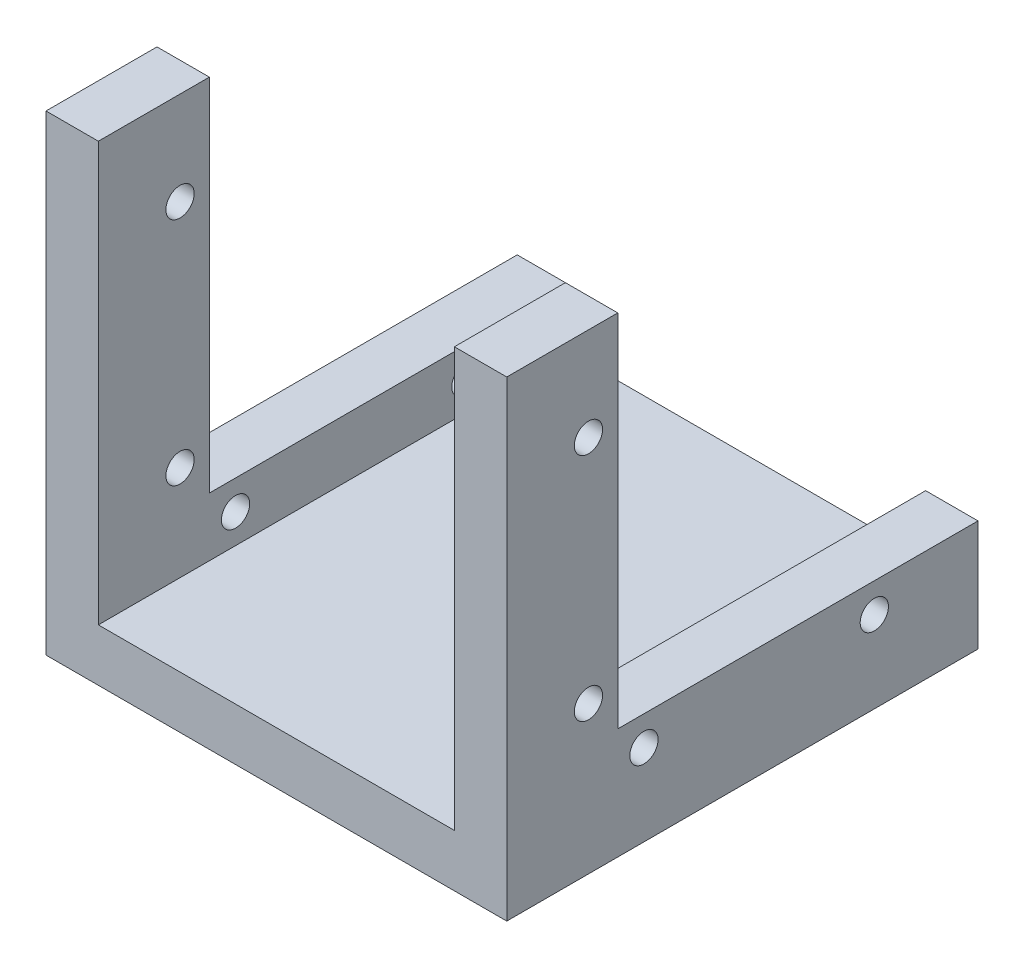
ISO-10303-21;
HEADER;
FILE_DESCRIPTION(('STEP AP214'),'2;1');
FILE_NAME('part.step','',(''),(''),'','','');
FILE_SCHEMA(('AUTOMOTIVE_DESIGN { 1 0 10303 214 1 1 1 1 }'));
ENDSEC;
DATA;
#1=APPLICATION_CONTEXT('core data for automotive mechanical design processes');
#2=APPLICATION_PROTOCOL_DEFINITION('international standard','automotive_design',2000,#1);
#3=PRODUCT_CONTEXT('',#1,'mechanical');
#4=PRODUCT('Part','Part','',(#3));
#5=PRODUCT_RELATED_PRODUCT_CATEGORY('part','',(#4));
#6=PRODUCT_DEFINITION_FORMATION('','',#4);
#7=PRODUCT_DEFINITION_CONTEXT('part definition',#1,'design');
#8=PRODUCT_DEFINITION('design','',#6,#7);
#9=PRODUCT_DEFINITION_SHAPE('','',#8);
#10=(LENGTH_UNIT() NAMED_UNIT(*) SI_UNIT(.MILLI.,.METRE.));
#11=(NAMED_UNIT(*) PLANE_ANGLE_UNIT() SI_UNIT($,.RADIAN.));
#12=(NAMED_UNIT(*) SI_UNIT($,.STERADIAN.) SOLID_ANGLE_UNIT());
#13=UNCERTAINTY_MEASURE_WITH_UNIT(LENGTH_MEASURE(1.E-05),#10,'distance_accuracy_value','');
#14=(GEOMETRIC_REPRESENTATION_CONTEXT(3) GLOBAL_UNCERTAINTY_ASSIGNED_CONTEXT((#13)) GLOBAL_UNIT_ASSIGNED_CONTEXT((#10,
#11,#12)) REPRESENTATION_CONTEXT('',''));
#15=CARTESIAN_POINT('',(0.,0.,0.));
#16=DIRECTION('',(0.,0.,1.));
#17=DIRECTION('',(1.,0.,0.));
#18=AXIS2_PLACEMENT_3D('',#15,#16,#17);
#19=CARTESIAN_POINT('',(0.,45.,45.));
#20=DIRECTION('',(1.,0.,0.));
#21=DIRECTION('',(0.,1.,0.));
#22=AXIS2_PLACEMENT_3D('',#19,#20,#21);
#23=PLANE('',#22);
#24=CARTESIAN_POINT('',(0.,7.80000000000001,9.90000000000001));
#25=DIRECTION('',(1.,0.,0.));
#26=DIRECTION('',(0.,0.,-1.));
#27=AXIS2_PLACEMENT_3D('',#24,#25,#26);
#28=CIRCLE('',#27,1.35);
#29=CARTESIAN_POINT('',(0.,7.80000000000001,8.55000000000001));
#30=VERTEX_POINT('',#29);
#31=EDGE_CURVE('E265',#30,#30,#28,.T.);
#32=ORIENTED_EDGE('',*,*,#31,.T.);
#33=EDGE_LOOP('',(#32));
#34=FACE_BOUND('',#33,.T.);
#35=CARTESIAN_POINT('',(0.,7.80000000000001,31.9));
#36=DIRECTION('',(1.,0.,0.));
#37=DIRECTION('',(0.,0.,-1.));
#38=AXIS2_PLACEMENT_3D('',#35,#36,#37);
#39=CIRCLE('',#38,1.35000000000001);
#40=CARTESIAN_POINT('',(0.,7.80000000000001,30.55));
#41=VERTEX_POINT('',#40);
#42=EDGE_CURVE('E272',#41,#41,#39,.T.);
#43=ORIENTED_EDGE('',*,*,#42,.T.);
#44=EDGE_LOOP('',(#43));
#45=FACE_BOUND('',#44,.T.);
#46=CARTESIAN_POINT('',(0.,14.1,37.2));
#47=DIRECTION('',(1.,0.,0.));
#48=DIRECTION('',(0.,0.,-1.));
#49=AXIS2_PLACEMENT_3D('',#46,#47,#48);
#50=CIRCLE('',#49,1.35);
#51=CARTESIAN_POINT('',(0.,14.1,35.85));
#52=VERTEX_POINT('',#51);
#53=EDGE_CURVE('E278',#52,#52,#50,.T.);
#54=ORIENTED_EDGE('',*,*,#53,.T.);
#55=EDGE_LOOP('',(#54));
#56=FACE_BOUND('',#55,.T.);
#57=CARTESIAN_POINT('',(0.,36.1,37.2));
#58=DIRECTION('',(1.,0.,0.));
#59=DIRECTION('',(0.,0.,-1.));
#60=AXIS2_PLACEMENT_3D('',#57,#58,#59);
#61=CIRCLE('',#60,1.35);
#62=CARTESIAN_POINT('',(0.,36.1,35.85));
#63=VERTEX_POINT('',#62);
#64=EDGE_CURVE('E264',#63,#63,#61,.T.);
#65=ORIENTED_EDGE('',*,*,#64,.T.);
#66=EDGE_LOOP('',(#65));
#67=FACE_BOUND('',#66,.T.);
#68=DIRECTION('',(0.,-1.,0.));
#69=VECTOR('',#68,1.);
#70=CARTESIAN_POINT('',(0.,10.6,34.4));
#71=LINE('',#70,#69);
#72=CARTESIAN_POINT('',(0.,45.,34.4));
#73=VERTEX_POINT('',#72);
#74=CARTESIAN_POINT('',(0.,10.6,34.4));
#75=VERTEX_POINT('',#74);
#76=EDGE_CURVE('E255',#73,#75,#71,.T.);
#77=ORIENTED_EDGE('',*,*,#76,.T.);
#78=DIRECTION('',(0.,0.,-1.));
#79=VECTOR('',#78,1.);
#80=CARTESIAN_POINT('',(0.,10.6,34.4));
#81=LINE('',#80,#79);
#82=CARTESIAN_POINT('',(0.,10.6,0.));
#83=VERTEX_POINT('',#82);
#84=EDGE_CURVE('E147',#75,#83,#81,.T.);
#85=ORIENTED_EDGE('',*,*,#84,.T.);
#86=DIRECTION('',(0.,-1.,0.));
#87=VECTOR('',#86,1.);
#88=CARTESIAN_POINT('',(0.,45.,0.));
#89=LINE('',#88,#87);
#90=CARTESIAN_POINT('',(0.,0.,0.));
#91=VERTEX_POINT('',#90);
#92=EDGE_CURVE('E186',#83,#91,#89,.T.);
#93=ORIENTED_EDGE('',*,*,#92,.T.);
#94=DIRECTION('',(0.,0.,-1.));
#95=VECTOR('',#94,1.);
#96=CARTESIAN_POINT('',(0.,0.,45.));
#97=LINE('',#96,#95);
#98=CARTESIAN_POINT('',(0.,0.,45.));
#99=VERTEX_POINT('',#98);
#100=EDGE_CURVE('E44',#99,#91,#97,.T.);
#101=ORIENTED_EDGE('',*,*,#100,.F.);
#102=DIRECTION('',(0.,-1.,0.));
#103=VECTOR('',#102,1.);
#104=CARTESIAN_POINT('',(0.,45.,45.));
#105=LINE('',#104,#103);
#106=CARTESIAN_POINT('',(0.,45.,45.));
#107=VERTEX_POINT('',#106);
#108=EDGE_CURVE('E187',#107,#99,#105,.T.);
#109=ORIENTED_EDGE('',*,*,#108,.F.);
#110=DIRECTION('',(0.,0.,-1.));
#111=VECTOR('',#110,1.);
#112=CARTESIAN_POINT('',(0.,45.,45.));
#113=LINE('',#112,#111);
#114=EDGE_CURVE('E204',#107,#73,#113,.T.);
#115=ORIENTED_EDGE('',*,*,#114,.T.);
#116=EDGE_LOOP('',(#77,#85,#93,#101,#109,#115));
#117=FACE_BOUND('',#116,.T.);
#118=ADVANCED_FACE('F36',(#34,#45,#56,#67,#117),#23,.F.);
#119=CARTESIAN_POINT('',(0.,0.,45.));
#120=DIRECTION('',(0.,1.,0.));
#121=DIRECTION('',(0.,0.,1.));
#122=AXIS2_PLACEMENT_3D('',#119,#120,#121);
#123=PLANE('',#122);
#124=DIRECTION('',(1.,0.,0.));
#125=VECTOR('',#124,1.);
#126=CARTESIAN_POINT('',(0.,0.,0.));
#127=LINE('',#126,#125);
#128=CARTESIAN_POINT('',(44.,0.,0.));
#129=VERTEX_POINT('',#128);
#130=EDGE_CURVE('E206',#91,#129,#127,.T.);
#131=ORIENTED_EDGE('',*,*,#130,.T.);
#132=DIRECTION('',(0.,0.,-1.));
#133=VECTOR('',#132,1.);
#134=CARTESIAN_POINT('',(44.,0.,45.));
#135=LINE('',#134,#133);
#136=CARTESIAN_POINT('',(44.,0.,45.));
#137=VERTEX_POINT('',#136);
#138=EDGE_CURVE('E151',#137,#129,#135,.T.);
#139=ORIENTED_EDGE('',*,*,#138,.F.);
#140=DIRECTION('',(1.,0.,0.));
#141=VECTOR('',#140,1.);
#142=CARTESIAN_POINT('',(0.,0.,45.));
#143=LINE('',#142,#141);
#144=EDGE_CURVE('E190',#99,#137,#143,.T.);
#145=ORIENTED_EDGE('',*,*,#144,.F.);
#146=ORIENTED_EDGE('',*,*,#100,.T.);
#147=EDGE_LOOP('',(#131,#139,#145,#146));
#148=FACE_BOUND('',#147,.T.);
#149=ADVANCED_FACE('F293',(#148),#123,.F.);
#150=CARTESIAN_POINT('',(44.,0.,45.));
#151=DIRECTION('',(-1.,0.,0.));
#152=DIRECTION('',(0.,0.,1.));
#153=AXIS2_PLACEMENT_3D('',#150,#151,#152);
#154=PLANE('',#153);
#155=CARTESIAN_POINT('',(44.,7.80000000000001,9.90000000000001));
#156=DIRECTION('',(1.,0.,0.));
#157=DIRECTION('',(0.,0.,-1.));
#158=AXIS2_PLACEMENT_3D('',#155,#156,#157);
#159=CIRCLE('',#158,1.35);
#160=CARTESIAN_POINT('',(44.,7.80000000000001,8.55000000000001));
#161=VERTEX_POINT('',#160);
#162=EDGE_CURVE('E269',#161,#161,#159,.T.);
#163=ORIENTED_EDGE('',*,*,#162,.F.);
#164=EDGE_LOOP('',(#163));
#165=FACE_BOUND('',#164,.T.);
#166=CARTESIAN_POINT('',(44.,7.80000000000001,31.9));
#167=DIRECTION('',(1.,0.,0.));
#168=DIRECTION('',(0.,0.,-1.));
#169=AXIS2_PLACEMENT_3D('',#166,#167,#168);
#170=CIRCLE('',#169,1.35000000000001);
#171=CARTESIAN_POINT('',(44.,7.80000000000001,30.55));
#172=VERTEX_POINT('',#171);
#173=EDGE_CURVE('E268',#172,#172,#170,.T.);
#174=ORIENTED_EDGE('',*,*,#173,.F.);
#175=EDGE_LOOP('',(#174));
#176=FACE_BOUND('',#175,.T.);
#177=CARTESIAN_POINT('',(44.,14.1,37.2));
#178=DIRECTION('',(1.,0.,0.));
#179=DIRECTION('',(0.,0.,-1.));
#180=AXIS2_PLACEMENT_3D('',#177,#178,#179);
#181=CIRCLE('',#180,1.35);
#182=CARTESIAN_POINT('',(44.,14.1,35.85));
#183=VERTEX_POINT('',#182);
#184=EDGE_CURVE('E275',#183,#183,#181,.T.);
#185=ORIENTED_EDGE('',*,*,#184,.F.);
#186=EDGE_LOOP('',(#185));
#187=FACE_BOUND('',#186,.T.);
#188=CARTESIAN_POINT('',(44.,36.1,37.2));
#189=DIRECTION('',(1.,0.,0.));
#190=DIRECTION('',(0.,0.,-1.));
#191=AXIS2_PLACEMENT_3D('',#188,#189,#190);
#192=CIRCLE('',#191,1.35);
#193=CARTESIAN_POINT('',(44.,36.1,35.85));
#194=VERTEX_POINT('',#193);
#195=EDGE_CURVE('E281',#194,#194,#192,.T.);
#196=ORIENTED_EDGE('',*,*,#195,.F.);
#197=EDGE_LOOP('',(#196));
#198=FACE_BOUND('',#197,.T.);
#199=DIRECTION('',(0.,1.,0.));
#200=VECTOR('',#199,1.);
#201=CARTESIAN_POINT('',(44.,0.,0.));
#202=LINE('',#201,#200);
#203=CARTESIAN_POINT('',(44.,10.6,0.));
#204=VERTEX_POINT('',#203);
#205=EDGE_CURVE('E208',#129,#204,#202,.T.);
#206=ORIENTED_EDGE('',*,*,#205,.T.);
#207=DIRECTION('',(0.,0.,-1.));
#208=VECTOR('',#207,1.);
#209=CARTESIAN_POINT('',(44.,10.6,34.4));
#210=LINE('',#209,#208);
#211=CARTESIAN_POINT('',(44.,10.6,34.4));
#212=VERTEX_POINT('',#211);
#213=EDGE_CURVE('E52',#212,#204,#210,.T.);
#214=ORIENTED_EDGE('',*,*,#213,.F.);
#215=DIRECTION('',(0.,-1.,0.));
#216=VECTOR('',#215,1.);
#217=CARTESIAN_POINT('',(44.,10.6,34.4));
#218=LINE('',#217,#216);
#219=CARTESIAN_POINT('',(44.,45.,34.4));
#220=VERTEX_POINT('',#219);
#221=EDGE_CURVE('E130',#220,#212,#218,.T.);
#222=ORIENTED_EDGE('',*,*,#221,.F.);
#223=DIRECTION('',(0.,0.,-1.));
#224=VECTOR('',#223,1.);
#225=CARTESIAN_POINT('',(44.,45.,45.));
#226=LINE('',#225,#224);
#227=CARTESIAN_POINT('',(44.,45.,45.));
#228=VERTEX_POINT('',#227);
#229=EDGE_CURVE('E145',#228,#220,#226,.T.);
#230=ORIENTED_EDGE('',*,*,#229,.F.);
#231=DIRECTION('',(0.,1.,0.));
#232=VECTOR('',#231,1.);
#233=CARTESIAN_POINT('',(44.,0.,45.));
#234=LINE('',#233,#232);
#235=EDGE_CURVE('E193',#137,#228,#234,.T.);
#236=ORIENTED_EDGE('',*,*,#235,.F.);
#237=ORIENTED_EDGE('',*,*,#138,.T.);
#238=EDGE_LOOP('',(#206,#214,#222,#230,#236,#237));
#239=FACE_BOUND('',#238,.T.);
#240=ADVANCED_FACE('F143',(#165,#176,#187,#198,#239),#154,.F.);
#241=CARTESIAN_POINT('',(44.,45.,45.));
#242=DIRECTION('',(0.,-1.,0.));
#243=DIRECTION('',(0.,0.,-1.));
#244=AXIS2_PLACEMENT_3D('',#241,#242,#243);
#245=PLANE('',#244);
#246=ORIENTED_EDGE('',*,*,#229,.T.);
#247=DIRECTION('',(1.,0.,0.));
#248=VECTOR('',#247,1.);
#249=CARTESIAN_POINT('',(0.,45.,34.4));
#250=LINE('',#249,#248);
#251=CARTESIAN_POINT('',(39.,45.,34.4));
#252=VERTEX_POINT('',#251);
#253=EDGE_CURVE('E126',#252,#220,#250,.T.);
#254=ORIENTED_EDGE('',*,*,#253,.F.);
#255=DIRECTION('',(0.,0.,-1.));
#256=VECTOR('',#255,1.);
#257=CARTESIAN_POINT('',(39.,45.,45.));
#258=LINE('',#257,#256);
#259=CARTESIAN_POINT('',(39.,45.,45.));
#260=VERTEX_POINT('',#259);
#261=EDGE_CURVE('E152',#260,#252,#258,.T.);
#262=ORIENTED_EDGE('',*,*,#261,.F.);
#263=DIRECTION('',(-1.,0.,0.));
#264=VECTOR('',#263,1.);
#265=CARTESIAN_POINT('',(44.,45.,45.));
#266=LINE('',#265,#264);
#267=EDGE_CURVE('E150',#228,#260,#266,.T.);
#268=ORIENTED_EDGE('',*,*,#267,.F.);
#269=EDGE_LOOP('',(#246,#254,#262,#268));
#270=FACE_BOUND('',#269,.T.);
#271=ADVANCED_FACE('F149',(#270),#245,.F.);
#272=CARTESIAN_POINT('',(39.,45.,45.));
#273=DIRECTION('',(1.,0.,0.));
#274=DIRECTION('',(0.,1.,0.));
#275=AXIS2_PLACEMENT_3D('',#272,#273,#274);
#276=PLANE('',#275);
#277=CARTESIAN_POINT('',(39.,7.80000000000001,9.90000000000001));
#278=DIRECTION('',(1.,0.,0.));
#279=DIRECTION('',(0.,1.,0.));
#280=AXIS2_PLACEMENT_3D('',#277,#278,#279);
#281=CIRCLE('',#280,1.35);
#282=CARTESIAN_POINT('',(39.,9.15000000000002,9.90000000000001));
#283=VERTEX_POINT('',#282);
#284=EDGE_CURVE('E183',#283,#283,#281,.T.);
#285=ORIENTED_EDGE('',*,*,#284,.T.);
#286=EDGE_LOOP('',(#285));
#287=FACE_BOUND('',#286,.T.);
#288=CARTESIAN_POINT('',(39.,7.80000000000001,31.9));
#289=DIRECTION('',(1.,0.,0.));
#290=DIRECTION('',(0.,1.,0.));
#291=AXIS2_PLACEMENT_3D('',#288,#289,#290);
#292=CIRCLE('',#291,1.35000000000001);
#293=CARTESIAN_POINT('',(39.,9.15000000000002,31.9));
#294=VERTEX_POINT('',#293);
#295=EDGE_CURVE('E171',#294,#294,#292,.T.);
#296=ORIENTED_EDGE('',*,*,#295,.T.);
#297=EDGE_LOOP('',(#296));
#298=FACE_BOUND('',#297,.T.);
#299=CARTESIAN_POINT('',(39.,14.1,37.2));
#300=DIRECTION('',(1.,0.,0.));
#301=DIRECTION('',(0.,1.,0.));
#302=AXIS2_PLACEMENT_3D('',#299,#300,#301);
#303=CIRCLE('',#302,1.35);
#304=CARTESIAN_POINT('',(39.,15.45,37.2));
#305=VERTEX_POINT('',#304);
#306=EDGE_CURVE('E168',#305,#305,#303,.T.);
#307=ORIENTED_EDGE('',*,*,#306,.T.);
#308=EDGE_LOOP('',(#307));
#309=FACE_BOUND('',#308,.T.);
#310=CARTESIAN_POINT('',(39.,36.1,37.2));
#311=DIRECTION('',(1.,0.,0.));
#312=DIRECTION('',(0.,1.,0.));
#313=AXIS2_PLACEMENT_3D('',#310,#311,#312);
#314=CIRCLE('',#313,1.35);
#315=CARTESIAN_POINT('',(39.,37.45,37.2));
#316=VERTEX_POINT('',#315);
#317=EDGE_CURVE('E165',#316,#316,#314,.T.);
#318=ORIENTED_EDGE('',*,*,#317,.T.);
#319=EDGE_LOOP('',(#318));
#320=FACE_BOUND('',#319,.T.);
#321=DIRECTION('',(0.,-1.,0.));
#322=VECTOR('',#321,1.);
#323=CARTESIAN_POINT('',(39.,45.,34.4));
#324=LINE('',#323,#322);
#325=CARTESIAN_POINT('',(39.,10.6,34.4));
#326=VERTEX_POINT('',#325);
#327=EDGE_CURVE('E132',#252,#326,#324,.T.);
#328=ORIENTED_EDGE('',*,*,#327,.T.);
#329=DIRECTION('',(0.,0.,-1.));
#330=VECTOR('',#329,1.);
#331=CARTESIAN_POINT('',(39.,10.6,45.));
#332=LINE('',#331,#330);
#333=CARTESIAN_POINT('',(39.,10.6,0.));
#334=VERTEX_POINT('',#333);
#335=EDGE_CURVE('E248',#326,#334,#332,.T.);
#336=ORIENTED_EDGE('',*,*,#335,.T.);
#337=DIRECTION('',(0.,-1.,0.));
#338=VECTOR('',#337,1.);
#339=CARTESIAN_POINT('',(39.,45.,0.));
#340=LINE('',#339,#338);
#341=CARTESIAN_POINT('',(39.,5.,0.));
#342=VERTEX_POINT('',#341);
#343=EDGE_CURVE('E210',#334,#342,#340,.T.);
#344=ORIENTED_EDGE('',*,*,#343,.T.);
#345=DIRECTION('',(0.,0.,-1.));
#346=VECTOR('',#345,1.);
#347=CARTESIAN_POINT('',(39.,5.,45.));
#348=LINE('',#347,#346);
#349=CARTESIAN_POINT('',(39.,5.,45.));
#350=VERTEX_POINT('',#349);
#351=EDGE_CURVE('E156',#350,#342,#348,.T.);
#352=ORIENTED_EDGE('',*,*,#351,.F.);
#353=DIRECTION('',(0.,-1.,0.));
#354=VECTOR('',#353,1.);
#355=CARTESIAN_POINT('',(39.,45.,45.));
#356=LINE('',#355,#354);
#357=EDGE_CURVE('E196',#260,#350,#356,.T.);
#358=ORIENTED_EDGE('',*,*,#357,.F.);
#359=ORIENTED_EDGE('',*,*,#261,.T.);
#360=EDGE_LOOP('',(#328,#336,#344,#352,#358,#359));
#361=FACE_BOUND('',#360,.T.);
#362=ADVANCED_FACE('F246',(#287,#298,#309,#320,#361),#276,.F.);
#363=CARTESIAN_POINT('',(39.,5.,45.));
#364=DIRECTION('',(0.,-1.,0.));
#365=DIRECTION('',(1.,0.,0.));
#366=AXIS2_PLACEMENT_3D('',#363,#364,#365);
#367=PLANE('',#366);
#368=DIRECTION('',(-1.,0.,0.));
#369=VECTOR('',#368,1.);
#370=CARTESIAN_POINT('',(39.,5.,0.));
#371=LINE('',#370,#369);
#372=CARTESIAN_POINT('',(5.,5.,0.));
#373=VERTEX_POINT('',#372);
#374=EDGE_CURVE('E212',#342,#373,#371,.T.);
#375=ORIENTED_EDGE('',*,*,#374,.T.);
#376=DIRECTION('',(0.,0.,-1.));
#377=VECTOR('',#376,1.);
#378=CARTESIAN_POINT('',(5.,5.,45.));
#379=LINE('',#378,#377);
#380=CARTESIAN_POINT('',(5.,5.,45.));
#381=VERTEX_POINT('',#380);
#382=EDGE_CURVE('E221',#381,#373,#379,.T.);
#383=ORIENTED_EDGE('',*,*,#382,.F.);
#384=DIRECTION('',(-1.,0.,0.));
#385=VECTOR('',#384,1.);
#386=CARTESIAN_POINT('',(39.,5.,45.));
#387=LINE('',#386,#385);
#388=EDGE_CURVE('E198',#350,#381,#387,.T.);
#389=ORIENTED_EDGE('',*,*,#388,.F.);
#390=ORIENTED_EDGE('',*,*,#351,.T.);
#391=EDGE_LOOP('',(#375,#383,#389,#390));
#392=FACE_BOUND('',#391,.T.);
#393=ADVANCED_FACE('F228',(#392),#367,.F.);
#394=CARTESIAN_POINT('',(5.,5.,45.));
#395=DIRECTION('',(-1.,0.,0.));
#396=DIRECTION('',(0.,0.,1.));
#397=AXIS2_PLACEMENT_3D('',#394,#395,#396);
#398=PLANE('',#397);
#399=CARTESIAN_POINT('',(5.,7.80000000000001,9.90000000000001));
#400=DIRECTION('',(-1.,0.,0.));
#401=DIRECTION('',(0.,0.,1.));
#402=AXIS2_PLACEMENT_3D('',#399,#400,#401);
#403=CIRCLE('',#402,1.35);
#404=CARTESIAN_POINT('',(5.,7.80000000000001,11.25));
#405=VERTEX_POINT('',#404);
#406=EDGE_CURVE('E39',#405,#405,#403,.T.);
#407=ORIENTED_EDGE('',*,*,#406,.T.);
#408=EDGE_LOOP('',(#407));
#409=FACE_BOUND('',#408,.T.);
#410=CARTESIAN_POINT('',(5.,7.80000000000001,31.9));
#411=DIRECTION('',(-1.,0.,0.));
#412=DIRECTION('',(0.,0.,1.));
#413=AXIS2_PLACEMENT_3D('',#410,#411,#412);
#414=CIRCLE('',#413,1.35000000000001);
#415=CARTESIAN_POINT('',(5.,7.80000000000001,33.25));
#416=VERTEX_POINT('',#415);
#417=EDGE_CURVE('E169',#416,#416,#414,.T.);
#418=ORIENTED_EDGE('',*,*,#417,.T.);
#419=EDGE_LOOP('',(#418));
#420=FACE_BOUND('',#419,.T.);
#421=CARTESIAN_POINT('',(5.,14.1,37.2));
#422=DIRECTION('',(-1.,0.,0.));
#423=DIRECTION('',(0.,0.,1.));
#424=AXIS2_PLACEMENT_3D('',#421,#422,#423);
#425=CIRCLE('',#424,1.35);
#426=CARTESIAN_POINT('',(5.,14.1,38.55));
#427=VERTEX_POINT('',#426);
#428=EDGE_CURVE('E166',#427,#427,#425,.T.);
#429=ORIENTED_EDGE('',*,*,#428,.T.);
#430=EDGE_LOOP('',(#429));
#431=FACE_BOUND('',#430,.T.);
#432=CARTESIAN_POINT('',(5.,36.1,37.2));
#433=DIRECTION('',(-1.,0.,0.));
#434=DIRECTION('',(0.,0.,1.));
#435=AXIS2_PLACEMENT_3D('',#432,#433,#434);
#436=CIRCLE('',#435,1.35);
#437=CARTESIAN_POINT('',(5.,36.1,38.55));
#438=VERTEX_POINT('',#437);
#439=EDGE_CURVE('E162',#438,#438,#436,.T.);
#440=ORIENTED_EDGE('',*,*,#439,.T.);
#441=EDGE_LOOP('',(#440));
#442=FACE_BOUND('',#441,.T.);
#443=DIRECTION('',(0.,1.,0.));
#444=VECTOR('',#443,1.);
#445=CARTESIAN_POINT('',(5.,5.,0.));
#446=LINE('',#445,#444);
#447=CARTESIAN_POINT('',(5.,10.6,0.));
#448=VERTEX_POINT('',#447);
#449=EDGE_CURVE('E191',#373,#448,#446,.T.);
#450=ORIENTED_EDGE('',*,*,#449,.T.);
#451=DIRECTION('',(0.,0.,1.));
#452=VECTOR('',#451,1.);
#453=CARTESIAN_POINT('',(5.,10.6,45.));
#454=LINE('',#453,#452);
#455=CARTESIAN_POINT('',(5.,10.6,34.4));
#456=VERTEX_POINT('',#455);
#457=EDGE_CURVE('E59',#448,#456,#454,.T.);
#458=ORIENTED_EDGE('',*,*,#457,.T.);
#459=DIRECTION('',(0.,1.,0.));
#460=VECTOR('',#459,1.);
#461=CARTESIAN_POINT('',(5.,5.,34.4));
#462=LINE('',#461,#460);
#463=CARTESIAN_POINT('',(5.,45.,34.4));
#464=VERTEX_POINT('',#463);
#465=EDGE_CURVE('E249',#456,#464,#462,.T.);
#466=ORIENTED_EDGE('',*,*,#465,.T.);
#467=DIRECTION('',(0.,0.,-1.));
#468=VECTOR('',#467,1.);
#469=CARTESIAN_POINT('',(5.,45.,45.));
#470=LINE('',#469,#468);
#471=CARTESIAN_POINT('',(5.,45.,45.));
#472=VERTEX_POINT('',#471);
#473=EDGE_CURVE('E218',#472,#464,#470,.T.);
#474=ORIENTED_EDGE('',*,*,#473,.F.);
#475=DIRECTION('',(0.,1.,0.));
#476=VECTOR('',#475,1.);
#477=CARTESIAN_POINT('',(5.,5.,45.));
#478=LINE('',#477,#476);
#479=EDGE_CURVE('E200',#381,#472,#478,.T.);
#480=ORIENTED_EDGE('',*,*,#479,.F.);
#481=ORIENTED_EDGE('',*,*,#382,.T.);
#482=EDGE_LOOP('',(#450,#458,#466,#474,#480,#481));
#483=FACE_BOUND('',#482,.T.);
#484=ADVANCED_FACE('F238',(#409,#420,#431,#442,#483),#398,.F.);
#485=CARTESIAN_POINT('',(5.,45.,45.));
#486=DIRECTION('',(0.,-1.,0.));
#487=DIRECTION('',(0.,0.,-1.));
#488=AXIS2_PLACEMENT_3D('',#485,#486,#487);
#489=PLANE('',#488);
#490=ORIENTED_EDGE('',*,*,#473,.T.);
#491=EDGE_CURVE('E137',#73,#464,#250,.T.);
#492=ORIENTED_EDGE('',*,*,#491,.F.);
#493=ORIENTED_EDGE('',*,*,#114,.F.);
#494=DIRECTION('',(-1.,0.,0.));
#495=VECTOR('',#494,1.);
#496=CARTESIAN_POINT('',(5.,45.,45.));
#497=LINE('',#496,#495);
#498=EDGE_CURVE('E202',#472,#107,#497,.T.);
#499=ORIENTED_EDGE('',*,*,#498,.F.);
#500=EDGE_LOOP('',(#490,#492,#493,#499));
#501=FACE_BOUND('',#500,.T.);
#502=ADVANCED_FACE('F322',(#501),#489,.F.);
#503=CARTESIAN_POINT('',(0.,0.,45.));
#504=DIRECTION('',(0.,0.,1.));
#505=DIRECTION('',(1.,0.,0.));
#506=AXIS2_PLACEMENT_3D('',#503,#504,#505);
#507=PLANE('',#506);
#508=ORIENTED_EDGE('',*,*,#108,.T.);
#509=ORIENTED_EDGE('',*,*,#144,.T.);
#510=ORIENTED_EDGE('',*,*,#235,.T.);
#511=ORIENTED_EDGE('',*,*,#267,.T.);
#512=ORIENTED_EDGE('',*,*,#357,.T.);
#513=ORIENTED_EDGE('',*,*,#388,.T.);
#514=ORIENTED_EDGE('',*,*,#479,.T.);
#515=ORIENTED_EDGE('',*,*,#498,.T.);
#516=EDGE_LOOP('',(#508,#509,#510,#511,#512,#513,#514,#515));
#517=FACE_BOUND('',#516,.T.);
#518=ADVANCED_FACE('F244',(#517),#507,.T.);
#519=CARTESIAN_POINT('',(0.,0.,0.));
#520=DIRECTION('',(0.,0.,1.));
#521=DIRECTION('',(1.,0.,0.));
#522=AXIS2_PLACEMENT_3D('',#519,#520,#521);
#523=PLANE('',#522);
#524=ORIENTED_EDGE('',*,*,#92,.F.);
#525=DIRECTION('',(1.,0.,0.));
#526=VECTOR('',#525,1.);
#527=CARTESIAN_POINT('',(0.,10.6,0.));
#528=LINE('',#527,#526);
#529=EDGE_CURVE('E138',#83,#448,#528,.T.);
#530=ORIENTED_EDGE('',*,*,#529,.T.);
#531=ORIENTED_EDGE('',*,*,#449,.F.);
#532=ORIENTED_EDGE('',*,*,#374,.F.);
#533=ORIENTED_EDGE('',*,*,#343,.F.);
#534=DIRECTION('',(1.,0.,0.));
#535=VECTOR('',#534,1.);
#536=CARTESIAN_POINT('',(0.,10.6,0.));
#537=LINE('',#536,#535);
#538=EDGE_CURVE('E11',#334,#204,#537,.T.);
#539=ORIENTED_EDGE('',*,*,#538,.T.);
#540=ORIENTED_EDGE('',*,*,#205,.F.);
#541=ORIENTED_EDGE('',*,*,#130,.F.);
#542=EDGE_LOOP('',(#524,#530,#531,#532,#533,#539,#540,#541));
#543=FACE_BOUND('',#542,.T.);
#544=ADVANCED_FACE('F236',(#543),#523,.F.);
#545=CARTESIAN_POINT('',(0.,10.6,34.4));
#546=DIRECTION('',(0.,-1.,0.));
#547=DIRECTION('',(0.,0.,-1.));
#548=AXIS2_PLACEMENT_3D('',#545,#546,#547);
#549=PLANE('',#548);
#550=DIRECTION('',(1.,0.,0.));
#551=VECTOR('',#550,1.);
#552=CARTESIAN_POINT('',(0.,10.6,34.4));
#553=LINE('',#552,#551);
#554=EDGE_CURVE('E257',#326,#212,#553,.T.);
#555=ORIENTED_EDGE('',*,*,#554,.T.);
#556=ORIENTED_EDGE('',*,*,#213,.T.);
#557=ORIENTED_EDGE('',*,*,#538,.F.);
#558=ORIENTED_EDGE('',*,*,#335,.F.);
#559=EDGE_LOOP('',(#555,#556,#557,#558));
#560=FACE_BOUND('',#559,.T.);
#561=ADVANCED_FACE('F327',(#560),#549,.F.);
#562=CARTESIAN_POINT('',(0.,10.6,34.4));
#563=DIRECTION('',(0.,0.,1.));
#564=DIRECTION('',(1.,0.,0.));
#565=AXIS2_PLACEMENT_3D('',#562,#563,#564);
#566=PLANE('',#565);
#567=ORIENTED_EDGE('',*,*,#253,.T.);
#568=ORIENTED_EDGE('',*,*,#221,.T.);
#569=ORIENTED_EDGE('',*,*,#554,.F.);
#570=ORIENTED_EDGE('',*,*,#327,.F.);
#571=EDGE_LOOP('',(#567,#568,#569,#570));
#572=FACE_BOUND('',#571,.T.);
#573=ADVANCED_FACE('F128',(#572),#566,.F.);
#574=EDGE_CURVE('E254',#75,#456,#553,.T.);
#575=ORIENTED_EDGE('',*,*,#574,.F.);
#576=ORIENTED_EDGE('',*,*,#76,.F.);
#577=ORIENTED_EDGE('',*,*,#491,.T.);
#578=ORIENTED_EDGE('',*,*,#465,.F.);
#579=EDGE_LOOP('',(#575,#576,#577,#578));
#580=FACE_BOUND('',#579,.T.);
#581=ADVANCED_FACE('F320',(#580),#566,.F.);
#582=ORIENTED_EDGE('',*,*,#529,.F.);
#583=ORIENTED_EDGE('',*,*,#84,.F.);
#584=ORIENTED_EDGE('',*,*,#574,.T.);
#585=ORIENTED_EDGE('',*,*,#457,.F.);
#586=EDGE_LOOP('',(#582,#583,#584,#585));
#587=FACE_BOUND('',#586,.T.);
#588=ADVANCED_FACE('F330',(#587),#549,.F.);
#589=CARTESIAN_POINT('',(0.,36.1,37.2));
#590=DIRECTION('',(1.,0.,0.));
#591=DIRECTION('',(0.,0.,-1.));
#592=AXIS2_PLACEMENT_3D('',#589,#590,#591);
#593=CYLINDRICAL_SURFACE('',#592,1.35);
#594=ORIENTED_EDGE('',*,*,#64,.F.);
#595=EDGE_LOOP('',(#594));
#596=FACE_BOUND('',#595,.T.);
#597=ORIENTED_EDGE('',*,*,#439,.F.);
#598=EDGE_LOOP('',(#597));
#599=FACE_BOUND('',#598,.T.);
#600=ADVANCED_FACE('F339',(#596,#599),#593,.F.);
#601=CARTESIAN_POINT('',(0.,14.1,37.2));
#602=DIRECTION('',(1.,0.,0.));
#603=DIRECTION('',(0.,0.,-1.));
#604=AXIS2_PLACEMENT_3D('',#601,#602,#603);
#605=CYLINDRICAL_SURFACE('',#604,1.35);
#606=ORIENTED_EDGE('',*,*,#53,.F.);
#607=EDGE_LOOP('',(#606));
#608=FACE_BOUND('',#607,.T.);
#609=ORIENTED_EDGE('',*,*,#428,.F.);
#610=EDGE_LOOP('',(#609));
#611=FACE_BOUND('',#610,.T.);
#612=ADVANCED_FACE('F344',(#608,#611),#605,.F.);
#613=CARTESIAN_POINT('',(0.,7.80000000000001,31.9));
#614=DIRECTION('',(1.,0.,0.));
#615=DIRECTION('',(0.,0.,-1.));
#616=AXIS2_PLACEMENT_3D('',#613,#614,#615);
#617=CYLINDRICAL_SURFACE('',#616,1.35000000000001);
#618=ORIENTED_EDGE('',*,*,#42,.F.);
#619=EDGE_LOOP('',(#618));
#620=FACE_BOUND('',#619,.T.);
#621=ORIENTED_EDGE('',*,*,#417,.F.);
#622=EDGE_LOOP('',(#621));
#623=FACE_BOUND('',#622,.T.);
#624=ADVANCED_FACE('F360',(#620,#623),#617,.F.);
#625=CARTESIAN_POINT('',(0.,7.80000000000001,9.90000000000001));
#626=DIRECTION('',(1.,0.,0.));
#627=DIRECTION('',(0.,0.,-1.));
#628=AXIS2_PLACEMENT_3D('',#625,#626,#627);
#629=CYLINDRICAL_SURFACE('',#628,1.35);
#630=ORIENTED_EDGE('',*,*,#31,.F.);
#631=EDGE_LOOP('',(#630));
#632=FACE_BOUND('',#631,.T.);
#633=ORIENTED_EDGE('',*,*,#406,.F.);
#634=EDGE_LOOP('',(#633));
#635=FACE_BOUND('',#634,.T.);
#636=ADVANCED_FACE('F355',(#632,#635),#629,.F.);
#637=ORIENTED_EDGE('',*,*,#195,.T.);
#638=EDGE_LOOP('',(#637));
#639=FACE_BOUND('',#638,.T.);
#640=ORIENTED_EDGE('',*,*,#317,.F.);
#641=EDGE_LOOP('',(#640));
#642=FACE_BOUND('',#641,.T.);
#643=ADVANCED_FACE('F289',(#639,#642),#593,.F.);
#644=ORIENTED_EDGE('',*,*,#184,.T.);
#645=EDGE_LOOP('',(#644));
#646=FACE_BOUND('',#645,.T.);
#647=ORIENTED_EDGE('',*,*,#306,.F.);
#648=EDGE_LOOP('',(#647));
#649=FACE_BOUND('',#648,.T.);
#650=ADVANCED_FACE('F358',(#646,#649),#605,.F.);
#651=ORIENTED_EDGE('',*,*,#173,.T.);
#652=EDGE_LOOP('',(#651));
#653=FACE_BOUND('',#652,.T.);
#654=ORIENTED_EDGE('',*,*,#295,.F.);
#655=EDGE_LOOP('',(#654));
#656=FACE_BOUND('',#655,.T.);
#657=ADVANCED_FACE('F353',(#653,#656),#617,.F.);
#658=ORIENTED_EDGE('',*,*,#162,.T.);
#659=EDGE_LOOP('',(#658));
#660=FACE_BOUND('',#659,.T.);
#661=ORIENTED_EDGE('',*,*,#284,.F.);
#662=EDGE_LOOP('',(#661));
#663=FACE_BOUND('',#662,.T.);
#664=ADVANCED_FACE('F350',(#660,#663),#629,.F.);
#665=CLOSED_SHELL('',(#118,#149,#240,#271,#362,#393,#484,#502,#518,#544,#561,#573,#581,#588,
#600,#612,#624,#636,#643,#650,#657,#664));
#666=MANIFOLD_SOLID_BREP('B2',#665);
#667=ADVANCED_BREP_SHAPE_REPRESENTATION('',(#18,#666),#14);
#668=SHAPE_DEFINITION_REPRESENTATION(#9,#667);
ENDSEC;
END-ISO-10303-21;
